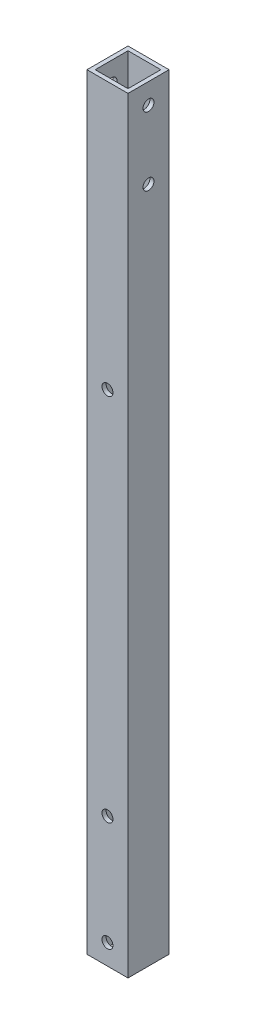
ISO-10303-21;
HEADER;
FILE_DESCRIPTION(('STEP AP214'),'2;1');
FILE_NAME('part.step','',(''),(''),'','','');
FILE_SCHEMA(('AUTOMOTIVE_DESIGN { 1 0 10303 214 1 1 1 1 }'));
ENDSEC;
DATA;
#1=APPLICATION_CONTEXT('core data for automotive mechanical design processes');
#2=APPLICATION_PROTOCOL_DEFINITION('international standard','automotive_design',2000,#1);
#3=PRODUCT_CONTEXT('',#1,'mechanical');
#4=PRODUCT('Part','Part','',(#3));
#5=PRODUCT_RELATED_PRODUCT_CATEGORY('part','',(#4));
#6=PRODUCT_DEFINITION_FORMATION('','',#4);
#7=PRODUCT_DEFINITION_CONTEXT('part definition',#1,'design');
#8=PRODUCT_DEFINITION('design','',#6,#7);
#9=PRODUCT_DEFINITION_SHAPE('','',#8);
#10=(LENGTH_UNIT() NAMED_UNIT(*) SI_UNIT(.MILLI.,.METRE.));
#11=(NAMED_UNIT(*) PLANE_ANGLE_UNIT() SI_UNIT($,.RADIAN.));
#12=(NAMED_UNIT(*) SI_UNIT($,.STERADIAN.) SOLID_ANGLE_UNIT());
#13=UNCERTAINTY_MEASURE_WITH_UNIT(LENGTH_MEASURE(1.E-05),#10,'distance_accuracy_value','');
#14=(GEOMETRIC_REPRESENTATION_CONTEXT(3) GLOBAL_UNCERTAINTY_ASSIGNED_CONTEXT((#13)) GLOBAL_UNIT_ASSIGNED_CONTEXT((#10,
#11,#12)) REPRESENTATION_CONTEXT('',''));
#15=CARTESIAN_POINT('',(0.,0.,0.));
#16=DIRECTION('',(0.,0.,1.));
#17=DIRECTION('',(1.,0.,0.));
#18=AXIS2_PLACEMENT_3D('',#15,#16,#17);
#19=CARTESIAN_POINT('',(0.,280.,0.));
#20=DIRECTION('',(0.,1.,0.));
#21=DIRECTION('',(0.,0.,1.));
#22=AXIS2_PLACEMENT_3D('',#19,#20,#21);
#23=PLANE('',#22);
#24=DIRECTION('',(0.,0.,-1.));
#25=VECTOR('',#24,1.);
#26=CARTESIAN_POINT('',(7.5,280.,7.5));
#27=LINE('',#26,#25);
#28=CARTESIAN_POINT('',(7.5,280.,7.5));
#29=VERTEX_POINT('',#28);
#30=CARTESIAN_POINT('',(7.5,280.,-7.5));
#31=VERTEX_POINT('',#30);
#32=EDGE_CURVE('E181',#29,#31,#27,.T.);
#33=ORIENTED_EDGE('',*,*,#32,.T.);
#34=DIRECTION('',(-1.,0.,0.));
#35=VECTOR('',#34,1.);
#36=CARTESIAN_POINT('',(-7.5,280.,-7.5));
#37=LINE('',#36,#35);
#38=CARTESIAN_POINT('',(-7.5,280.,-7.5));
#39=VERTEX_POINT('',#38);
#40=EDGE_CURVE('E185',#31,#39,#37,.T.);
#41=ORIENTED_EDGE('',*,*,#40,.T.);
#42=DIRECTION('',(0.,0.,1.));
#43=VECTOR('',#42,1.);
#44=CARTESIAN_POINT('',(-7.5,280.,7.5));
#45=LINE('',#44,#43);
#46=CARTESIAN_POINT('',(-7.5,280.,7.5));
#47=VERTEX_POINT('',#46);
#48=EDGE_CURVE('E189',#39,#47,#45,.T.);
#49=ORIENTED_EDGE('',*,*,#48,.T.);
#50=DIRECTION('',(1.,0.,0.));
#51=VECTOR('',#50,1.);
#52=CARTESIAN_POINT('',(-7.5,280.,7.5));
#53=LINE('',#52,#51);
#54=EDGE_CURVE('E192',#47,#29,#53,.T.);
#55=ORIENTED_EDGE('',*,*,#54,.T.);
#56=EDGE_LOOP('',(#33,#41,#49,#55));
#57=FACE_BOUND('',#56,.T.);
#58=DIRECTION('',(-1.,0.,0.));
#59=VECTOR('',#58,1.);
#60=CARTESIAN_POINT('',(0.,280.,-6.));
#61=LINE('',#60,#59);
#62=CARTESIAN_POINT('',(6.,280.,-6.));
#63=VERTEX_POINT('',#62);
#64=CARTESIAN_POINT('',(-6.,280.,-6.));
#65=VERTEX_POINT('',#64);
#66=EDGE_CURVE('E140',#63,#65,#61,.T.);
#67=ORIENTED_EDGE('',*,*,#66,.F.);
#68=DIRECTION('',(0.,0.,-1.));
#69=VECTOR('',#68,1.);
#70=CARTESIAN_POINT('',(6.,280.,0.));
#71=LINE('',#70,#69);
#72=CARTESIAN_POINT('',(6.,280.,6.));
#73=VERTEX_POINT('',#72);
#74=EDGE_CURVE('E131',#73,#63,#71,.T.);
#75=ORIENTED_EDGE('',*,*,#74,.F.);
#76=DIRECTION('',(1.,0.,0.));
#77=VECTOR('',#76,1.);
#78=CARTESIAN_POINT('',(0.,280.,6.));
#79=LINE('',#78,#77);
#80=CARTESIAN_POINT('',(-6.,280.,6.));
#81=VERTEX_POINT('',#80);
#82=EDGE_CURVE('E157',#81,#73,#79,.T.);
#83=ORIENTED_EDGE('',*,*,#82,.F.);
#84=DIRECTION('',(0.,0.,1.));
#85=VECTOR('',#84,1.);
#86=CARTESIAN_POINT('',(-6.,280.,0.));
#87=LINE('',#86,#85);
#88=EDGE_CURVE('E153',#65,#81,#87,.T.);
#89=ORIENTED_EDGE('',*,*,#88,.F.);
#90=EDGE_LOOP('',(#67,#75,#83,#89));
#91=FACE_BOUND('',#90,.T.);
#92=ADVANCED_FACE('F63',(#57,#91),#23,.T.);
#93=CARTESIAN_POINT('',(0.,0.,0.));
#94=DIRECTION('',(0.,1.,0.));
#95=DIRECTION('',(0.,0.,1.));
#96=AXIS2_PLACEMENT_3D('',#93,#94,#95);
#97=PLANE('',#96);
#98=DIRECTION('',(0.,0.,-1.));
#99=VECTOR('',#98,1.);
#100=CARTESIAN_POINT('',(7.5,0.,7.5));
#101=LINE('',#100,#99);
#102=CARTESIAN_POINT('',(7.5,0.,7.5));
#103=VERTEX_POINT('',#102);
#104=CARTESIAN_POINT('',(7.5,0.,-7.5));
#105=VERTEX_POINT('',#104);
#106=EDGE_CURVE('E149',#103,#105,#101,.T.);
#107=ORIENTED_EDGE('',*,*,#106,.F.);
#108=DIRECTION('',(1.,0.,0.));
#109=VECTOR('',#108,1.);
#110=CARTESIAN_POINT('',(-7.5,0.,7.5));
#111=LINE('',#110,#109);
#112=CARTESIAN_POINT('',(-7.5,0.,7.5));
#113=VERTEX_POINT('',#112);
#114=EDGE_CURVE('E186',#113,#103,#111,.T.);
#115=ORIENTED_EDGE('',*,*,#114,.F.);
#116=DIRECTION('',(0.,0.,1.));
#117=VECTOR('',#116,1.);
#118=CARTESIAN_POINT('',(-7.5,0.,7.5));
#119=LINE('',#118,#117);
#120=CARTESIAN_POINT('',(-7.5,0.,-7.5));
#121=VERTEX_POINT('',#120);
#122=EDGE_CURVE('E202',#121,#113,#119,.T.);
#123=ORIENTED_EDGE('',*,*,#122,.F.);
#124=DIRECTION('',(-1.,0.,0.));
#125=VECTOR('',#124,1.);
#126=CARTESIAN_POINT('',(-7.5,0.,-7.5));
#127=LINE('',#126,#125);
#128=EDGE_CURVE('E199',#105,#121,#127,.T.);
#129=ORIENTED_EDGE('',*,*,#128,.F.);
#130=EDGE_LOOP('',(#107,#115,#123,#129));
#131=FACE_BOUND('',#130,.T.);
#132=DIRECTION('',(0.,0.,-1.));
#133=VECTOR('',#132,1.);
#134=CARTESIAN_POINT('',(6.,0.,0.));
#135=LINE('',#134,#133);
#136=CARTESIAN_POINT('',(6.,0.,6.));
#137=VERTEX_POINT('',#136);
#138=CARTESIAN_POINT('',(6.,0.,-6.));
#139=VERTEX_POINT('',#138);
#140=EDGE_CURVE('E89',#137,#139,#135,.T.);
#141=ORIENTED_EDGE('',*,*,#140,.T.);
#142=DIRECTION('',(-1.,0.,0.));
#143=VECTOR('',#142,1.);
#144=CARTESIAN_POINT('',(0.,0.,-6.));
#145=LINE('',#144,#143);
#146=CARTESIAN_POINT('',(-6.,0.,-6.));
#147=VERTEX_POINT('',#146);
#148=EDGE_CURVE('E147',#139,#147,#145,.T.);
#149=ORIENTED_EDGE('',*,*,#148,.T.);
#150=DIRECTION('',(0.,0.,1.));
#151=VECTOR('',#150,1.);
#152=CARTESIAN_POINT('',(-6.,0.,0.));
#153=LINE('',#152,#151);
#154=CARTESIAN_POINT('',(-6.,0.,6.));
#155=VERTEX_POINT('',#154);
#156=EDGE_CURVE('E168',#147,#155,#153,.T.);
#157=ORIENTED_EDGE('',*,*,#156,.T.);
#158=DIRECTION('',(1.,0.,0.));
#159=VECTOR('',#158,1.);
#160=CARTESIAN_POINT('',(0.,0.,6.));
#161=LINE('',#160,#159);
#162=EDGE_CURVE('E141',#155,#137,#161,.T.);
#163=ORIENTED_EDGE('',*,*,#162,.T.);
#164=EDGE_LOOP('',(#141,#149,#157,#163));
#165=FACE_BOUND('',#164,.T.);
#166=ADVANCED_FACE('F295',(#131,#165),#97,.F.);
#167=CARTESIAN_POINT('',(7.5,280.,7.5));
#168=DIRECTION('',(-1.,0.,0.));
#169=DIRECTION('',(0.,0.,1.));
#170=AXIS2_PLACEMENT_3D('',#167,#168,#169);
#171=PLANE('',#170);
#172=CARTESIAN_POINT('',(7.5,272.5,0.));
#173=DIRECTION('',(1.,0.,0.));
#174=DIRECTION('',(0.,0.,-1.));
#175=AXIS2_PLACEMENT_3D('',#172,#173,#174);
#176=CIRCLE('',#175,2.);
#177=CARTESIAN_POINT('',(7.5,272.5,-2.));
#178=VERTEX_POINT('',#177);
#179=EDGE_CURVE('E258',#178,#178,#176,.T.);
#180=ORIENTED_EDGE('',*,*,#179,.F.);
#181=EDGE_LOOP('',(#180));
#182=FACE_BOUND('',#181,.T.);
#183=CARTESIAN_POINT('',(7.5,247.5,0.));
#184=DIRECTION('',(1.,0.,0.));
#185=DIRECTION('',(0.,0.,-1.));
#186=AXIS2_PLACEMENT_3D('',#183,#184,#185);
#187=CIRCLE('',#186,2.);
#188=CARTESIAN_POINT('',(7.5,247.5,-2.));
#189=VERTEX_POINT('',#188);
#190=EDGE_CURVE('E254',#189,#189,#187,.T.);
#191=ORIENTED_EDGE('',*,*,#190,.F.);
#192=EDGE_LOOP('',(#191));
#193=FACE_BOUND('',#192,.T.);
#194=ORIENTED_EDGE('',*,*,#106,.T.);
#195=DIRECTION('',(0.,-1.,0.));
#196=VECTOR('',#195,1.);
#197=CARTESIAN_POINT('',(7.5,280.,-7.5));
#198=LINE('',#197,#196);
#199=EDGE_CURVE('E12',#31,#105,#198,.T.);
#200=ORIENTED_EDGE('',*,*,#199,.F.);
#201=ORIENTED_EDGE('',*,*,#32,.F.);
#202=DIRECTION('',(0.,-1.,0.));
#203=VECTOR('',#202,1.);
#204=CARTESIAN_POINT('',(7.5,280.,7.5));
#205=LINE('',#204,#203);
#206=EDGE_CURVE('E195',#29,#103,#205,.T.);
#207=ORIENTED_EDGE('',*,*,#206,.T.);
#208=EDGE_LOOP('',(#194,#200,#201,#207));
#209=FACE_BOUND('',#208,.T.);
#210=ADVANCED_FACE('F65',(#182,#193,#209),#171,.F.);
#211=CARTESIAN_POINT('',(-7.5,280.,-7.5));
#212=DIRECTION('',(0.,0.,1.));
#213=DIRECTION('',(1.,0.,0.));
#214=AXIS2_PLACEMENT_3D('',#211,#212,#213);
#215=PLANE('',#214);
#216=CARTESIAN_POINT('',(0.,7.5,-7.5));
#217=DIRECTION('',(0.,0.,1.));
#218=DIRECTION('',(1.,0.,0.));
#219=AXIS2_PLACEMENT_3D('',#216,#217,#218);
#220=CIRCLE('',#219,2.);
#221=CARTESIAN_POINT('',(2.,7.5,-7.5));
#222=VERTEX_POINT('',#221);
#223=EDGE_CURVE('E231',#222,#222,#220,.T.);
#224=ORIENTED_EDGE('',*,*,#223,.T.);
#225=EDGE_LOOP('',(#224));
#226=FACE_BOUND('',#225,.T.);
#227=CARTESIAN_POINT('',(0.,47.5,-7.5));
#228=DIRECTION('',(0.,0.,1.));
#229=DIRECTION('',(1.,0.,0.));
#230=AXIS2_PLACEMENT_3D('',#227,#228,#229);
#231=CIRCLE('',#230,2.);
#232=CARTESIAN_POINT('',(2.,47.5,-7.5));
#233=VERTEX_POINT('',#232);
#234=EDGE_CURVE('E381',#233,#233,#231,.T.);
#235=ORIENTED_EDGE('',*,*,#234,.T.);
#236=EDGE_LOOP('',(#235));
#237=FACE_BOUND('',#236,.T.);
#238=CARTESIAN_POINT('',(0.,182.5,-7.5));
#239=DIRECTION('',(0.,0.,1.));
#240=DIRECTION('',(1.,0.,0.));
#241=AXIS2_PLACEMENT_3D('',#238,#239,#240);
#242=CIRCLE('',#241,2.);
#243=CARTESIAN_POINT('',(2.,182.5,-7.5));
#244=VERTEX_POINT('',#243);
#245=EDGE_CURVE('E390',#244,#244,#242,.T.);
#246=ORIENTED_EDGE('',*,*,#245,.T.);
#247=EDGE_LOOP('',(#246));
#248=FACE_BOUND('',#247,.T.);
#249=ORIENTED_EDGE('',*,*,#128,.T.);
#250=DIRECTION('',(0.,-1.,0.));
#251=VECTOR('',#250,1.);
#252=CARTESIAN_POINT('',(-7.5,280.,-7.5));
#253=LINE('',#252,#251);
#254=EDGE_CURVE('E73',#39,#121,#253,.T.);
#255=ORIENTED_EDGE('',*,*,#254,.F.);
#256=ORIENTED_EDGE('',*,*,#40,.F.);
#257=ORIENTED_EDGE('',*,*,#199,.T.);
#258=EDGE_LOOP('',(#249,#255,#256,#257));
#259=FACE_BOUND('',#258,.T.);
#260=ADVANCED_FACE('F294',(#226,#237,#248,#259),#215,.F.);
#261=CARTESIAN_POINT('',(-7.5,280.,7.5));
#262=DIRECTION('',(1.,0.,0.));
#263=DIRECTION('',(0.,0.,-1.));
#264=AXIS2_PLACEMENT_3D('',#261,#262,#263);
#265=PLANE('',#264);
#266=CARTESIAN_POINT('',(-7.5,272.5,0.));
#267=DIRECTION('',(1.,0.,0.));
#268=DIRECTION('',(0.,0.,-1.));
#269=AXIS2_PLACEMENT_3D('',#266,#267,#268);
#270=CIRCLE('',#269,2.);
#271=CARTESIAN_POINT('',(-7.5,272.5,-2.));
#272=VERTEX_POINT('',#271);
#273=EDGE_CURVE('E222',#272,#272,#270,.T.);
#274=ORIENTED_EDGE('',*,*,#273,.T.);
#275=EDGE_LOOP('',(#274));
#276=FACE_BOUND('',#275,.T.);
#277=CARTESIAN_POINT('',(-7.5,247.5,0.));
#278=DIRECTION('',(1.,0.,0.));
#279=DIRECTION('',(0.,0.,-1.));
#280=AXIS2_PLACEMENT_3D('',#277,#278,#279);
#281=CIRCLE('',#280,2.);
#282=CARTESIAN_POINT('',(-7.5,247.5,-2.));
#283=VERTEX_POINT('',#282);
#284=EDGE_CURVE('E262',#283,#283,#281,.T.);
#285=ORIENTED_EDGE('',*,*,#284,.T.);
#286=EDGE_LOOP('',(#285));
#287=FACE_BOUND('',#286,.T.);
#288=ORIENTED_EDGE('',*,*,#122,.T.);
#289=DIRECTION('',(0.,-1.,0.));
#290=VECTOR('',#289,1.);
#291=CARTESIAN_POINT('',(-7.5,280.,7.5));
#292=LINE('',#291,#290);
#293=EDGE_CURVE('E210',#47,#113,#292,.T.);
#294=ORIENTED_EDGE('',*,*,#293,.F.);
#295=ORIENTED_EDGE('',*,*,#48,.F.);
#296=ORIENTED_EDGE('',*,*,#254,.T.);
#297=EDGE_LOOP('',(#288,#294,#295,#296));
#298=FACE_BOUND('',#297,.T.);
#299=ADVANCED_FACE('F313',(#276,#287,#298),#265,.F.);
#300=CARTESIAN_POINT('',(-7.5,280.,7.5));
#301=DIRECTION('',(0.,0.,-1.));
#302=DIRECTION('',(-1.,0.,0.));
#303=AXIS2_PLACEMENT_3D('',#300,#301,#302);
#304=PLANE('',#303);
#305=CARTESIAN_POINT('',(0.,7.5,7.5));
#306=DIRECTION('',(0.,0.,1.));
#307=DIRECTION('',(1.,0.,0.));
#308=AXIS2_PLACEMENT_3D('',#305,#306,#307);
#309=CIRCLE('',#308,2.);
#310=CARTESIAN_POINT('',(2.,7.5,7.5));
#311=VERTEX_POINT('',#310);
#312=EDGE_CURVE('E377',#311,#311,#309,.T.);
#313=ORIENTED_EDGE('',*,*,#312,.F.);
#314=EDGE_LOOP('',(#313));
#315=FACE_BOUND('',#314,.T.);
#316=CARTESIAN_POINT('',(0.,47.5,7.5));
#317=DIRECTION('',(0.,0.,1.));
#318=DIRECTION('',(1.,0.,0.));
#319=AXIS2_PLACEMENT_3D('',#316,#317,#318);
#320=CIRCLE('',#319,2.);
#321=CARTESIAN_POINT('',(2.,47.5,7.5));
#322=VERTEX_POINT('',#321);
#323=EDGE_CURVE('E387',#322,#322,#320,.T.);
#324=ORIENTED_EDGE('',*,*,#323,.F.);
#325=EDGE_LOOP('',(#324));
#326=FACE_BOUND('',#325,.T.);
#327=CARTESIAN_POINT('',(0.,182.5,7.5));
#328=DIRECTION('',(0.,0.,1.));
#329=DIRECTION('',(1.,0.,0.));
#330=AXIS2_PLACEMENT_3D('',#327,#328,#329);
#331=CIRCLE('',#330,2.);
#332=CARTESIAN_POINT('',(2.,182.5,7.5));
#333=VERTEX_POINT('',#332);
#334=EDGE_CURVE('E247',#333,#333,#331,.T.);
#335=ORIENTED_EDGE('',*,*,#334,.F.);
#336=EDGE_LOOP('',(#335));
#337=FACE_BOUND('',#336,.T.);
#338=ORIENTED_EDGE('',*,*,#114,.T.);
#339=ORIENTED_EDGE('',*,*,#206,.F.);
#340=ORIENTED_EDGE('',*,*,#54,.F.);
#341=ORIENTED_EDGE('',*,*,#293,.T.);
#342=EDGE_LOOP('',(#338,#339,#340,#341));
#343=FACE_BOUND('',#342,.T.);
#344=ADVANCED_FACE('F280',(#315,#326,#337,#343),#304,.F.);
#345=CARTESIAN_POINT('',(6.,280.,0.));
#346=DIRECTION('',(-1.,0.,0.));
#347=DIRECTION('',(0.,0.,1.));
#348=AXIS2_PLACEMENT_3D('',#345,#346,#347);
#349=PLANE('',#348);
#350=CARTESIAN_POINT('',(6.,272.5,0.));
#351=DIRECTION('',(-1.,0.,0.));
#352=DIRECTION('',(0.,0.,1.));
#353=AXIS2_PLACEMENT_3D('',#350,#351,#352);
#354=CIRCLE('',#353,2.);
#355=CARTESIAN_POINT('',(6.,272.5,2.));
#356=VERTEX_POINT('',#355);
#357=EDGE_CURVE('E165',#356,#356,#354,.T.);
#358=ORIENTED_EDGE('',*,*,#357,.F.);
#359=EDGE_LOOP('',(#358));
#360=FACE_BOUND('',#359,.T.);
#361=CARTESIAN_POINT('',(6.,247.5,0.));
#362=DIRECTION('',(-1.,0.,0.));
#363=DIRECTION('',(0.,0.,1.));
#364=AXIS2_PLACEMENT_3D('',#361,#362,#363);
#365=CIRCLE('',#364,2.);
#366=CARTESIAN_POINT('',(6.,247.5,2.));
#367=VERTEX_POINT('',#366);
#368=EDGE_CURVE('E221',#367,#367,#365,.T.);
#369=ORIENTED_EDGE('',*,*,#368,.F.);
#370=EDGE_LOOP('',(#369));
#371=FACE_BOUND('',#370,.T.);
#372=ORIENTED_EDGE('',*,*,#140,.F.);
#373=DIRECTION('',(0.,-1.,0.));
#374=VECTOR('',#373,1.);
#375=CARTESIAN_POINT('',(6.,280.,6.));
#376=LINE('',#375,#374);
#377=EDGE_CURVE('E135',#73,#137,#376,.T.);
#378=ORIENTED_EDGE('',*,*,#377,.F.);
#379=ORIENTED_EDGE('',*,*,#74,.T.);
#380=DIRECTION('',(0.,-1.,0.));
#381=VECTOR('',#380,1.);
#382=CARTESIAN_POINT('',(6.,280.,-6.));
#383=LINE('',#382,#381);
#384=EDGE_CURVE('E134',#63,#139,#383,.T.);
#385=ORIENTED_EDGE('',*,*,#384,.T.);
#386=EDGE_LOOP('',(#372,#378,#379,#385));
#387=FACE_BOUND('',#386,.T.);
#388=ADVANCED_FACE('F133',(#360,#371,#387),#349,.T.);
#389=CARTESIAN_POINT('',(0.,280.,-6.));
#390=DIRECTION('',(0.,0.,1.));
#391=DIRECTION('',(1.,0.,0.));
#392=AXIS2_PLACEMENT_3D('',#389,#390,#391);
#393=PLANE('',#392);
#394=CARTESIAN_POINT('',(0.,7.5,-6.));
#395=DIRECTION('',(0.,0.,1.));
#396=DIRECTION('',(1.,0.,0.));
#397=AXIS2_PLACEMENT_3D('',#394,#395,#396);
#398=CIRCLE('',#397,2.);
#399=CARTESIAN_POINT('',(2.,7.5,-6.));
#400=VERTEX_POINT('',#399);
#401=EDGE_CURVE('E250',#400,#400,#398,.T.);
#402=ORIENTED_EDGE('',*,*,#401,.F.);
#403=EDGE_LOOP('',(#402));
#404=FACE_BOUND('',#403,.T.);
#405=CARTESIAN_POINT('',(0.,47.5,-6.));
#406=DIRECTION('',(0.,0.,1.));
#407=DIRECTION('',(1.,0.,0.));
#408=AXIS2_PLACEMENT_3D('',#405,#406,#407);
#409=CIRCLE('',#408,2.);
#410=CARTESIAN_POINT('',(2.,47.5,-6.));
#411=VERTEX_POINT('',#410);
#412=EDGE_CURVE('E235',#411,#411,#409,.T.);
#413=ORIENTED_EDGE('',*,*,#412,.F.);
#414=EDGE_LOOP('',(#413));
#415=FACE_BOUND('',#414,.T.);
#416=CARTESIAN_POINT('',(0.,182.5,-6.));
#417=DIRECTION('',(0.,0.,1.));
#418=DIRECTION('',(1.,0.,0.));
#419=AXIS2_PLACEMENT_3D('',#416,#417,#418);
#420=CIRCLE('',#419,2.);
#421=CARTESIAN_POINT('',(2.,182.5,-6.));
#422=VERTEX_POINT('',#421);
#423=EDGE_CURVE('E230',#422,#422,#420,.T.);
#424=ORIENTED_EDGE('',*,*,#423,.F.);
#425=EDGE_LOOP('',(#424));
#426=FACE_BOUND('',#425,.T.);
#427=ORIENTED_EDGE('',*,*,#148,.F.);
#428=ORIENTED_EDGE('',*,*,#384,.F.);
#429=ORIENTED_EDGE('',*,*,#66,.T.);
#430=DIRECTION('',(0.,-1.,0.));
#431=VECTOR('',#430,1.);
#432=CARTESIAN_POINT('',(-6.,280.,-6.));
#433=LINE('',#432,#431);
#434=EDGE_CURVE('E150',#65,#147,#433,.T.);
#435=ORIENTED_EDGE('',*,*,#434,.T.);
#436=EDGE_LOOP('',(#427,#428,#429,#435));
#437=FACE_BOUND('',#436,.T.);
#438=ADVANCED_FACE('F144',(#404,#415,#426,#437),#393,.T.);
#439=CARTESIAN_POINT('',(-6.,280.,0.));
#440=DIRECTION('',(1.,0.,0.));
#441=DIRECTION('',(0.,0.,-1.));
#442=AXIS2_PLACEMENT_3D('',#439,#440,#441);
#443=PLANE('',#442);
#444=CARTESIAN_POINT('',(-6.,272.5,0.));
#445=DIRECTION('',(1.,0.,0.));
#446=DIRECTION('',(0.,0.,-1.));
#447=AXIS2_PLACEMENT_3D('',#444,#445,#446);
#448=CIRCLE('',#447,2.);
#449=CARTESIAN_POINT('',(-6.,272.5,-2.));
#450=VERTEX_POINT('',#449);
#451=EDGE_CURVE('E223',#450,#450,#448,.T.);
#452=ORIENTED_EDGE('',*,*,#451,.F.);
#453=EDGE_LOOP('',(#452));
#454=FACE_BOUND('',#453,.T.);
#455=CARTESIAN_POINT('',(-6.,247.5,0.));
#456=DIRECTION('',(1.,0.,0.));
#457=DIRECTION('',(0.,0.,-1.));
#458=AXIS2_PLACEMENT_3D('',#455,#456,#457);
#459=CIRCLE('',#458,2.);
#460=CARTESIAN_POINT('',(-6.,247.5,-2.));
#461=VERTEX_POINT('',#460);
#462=EDGE_CURVE('E217',#461,#461,#459,.T.);
#463=ORIENTED_EDGE('',*,*,#462,.F.);
#464=EDGE_LOOP('',(#463));
#465=FACE_BOUND('',#464,.T.);
#466=ORIENTED_EDGE('',*,*,#156,.F.);
#467=ORIENTED_EDGE('',*,*,#434,.F.);
#468=ORIENTED_EDGE('',*,*,#88,.T.);
#469=DIRECTION('',(0.,-1.,0.));
#470=VECTOR('',#469,1.);
#471=CARTESIAN_POINT('',(-6.,280.,6.));
#472=LINE('',#471,#470);
#473=EDGE_CURVE('E81',#81,#155,#472,.T.);
#474=ORIENTED_EDGE('',*,*,#473,.T.);
#475=EDGE_LOOP('',(#466,#467,#468,#474));
#476=FACE_BOUND('',#475,.T.);
#477=ADVANCED_FACE('F334',(#454,#465,#476),#443,.T.);
#478=CARTESIAN_POINT('',(0.,280.,6.));
#479=DIRECTION('',(0.,0.,-1.));
#480=DIRECTION('',(-1.,0.,0.));
#481=AXIS2_PLACEMENT_3D('',#478,#479,#480);
#482=PLANE('',#481);
#483=CARTESIAN_POINT('',(0.,7.5,6.));
#484=DIRECTION('',(0.,0.,-1.));
#485=DIRECTION('',(-1.,0.,0.));
#486=AXIS2_PLACEMENT_3D('',#483,#484,#485);
#487=CIRCLE('',#486,2.);
#488=CARTESIAN_POINT('',(-2.,7.5,6.));
#489=VERTEX_POINT('',#488);
#490=EDGE_CURVE('E67',#489,#489,#487,.T.);
#491=ORIENTED_EDGE('',*,*,#490,.F.);
#492=EDGE_LOOP('',(#491));
#493=FACE_BOUND('',#492,.T.);
#494=CARTESIAN_POINT('',(0.,47.5,6.));
#495=DIRECTION('',(0.,0.,-1.));
#496=DIRECTION('',(-1.,0.,0.));
#497=AXIS2_PLACEMENT_3D('',#494,#495,#496);
#498=CIRCLE('',#497,2.);
#499=CARTESIAN_POINT('',(-2.,47.5,6.));
#500=VERTEX_POINT('',#499);
#501=EDGE_CURVE('E232',#500,#500,#498,.T.);
#502=ORIENTED_EDGE('',*,*,#501,.F.);
#503=EDGE_LOOP('',(#502));
#504=FACE_BOUND('',#503,.T.);
#505=CARTESIAN_POINT('',(0.,182.5,6.));
#506=DIRECTION('',(0.,0.,-1.));
#507=DIRECTION('',(-1.,0.,0.));
#508=AXIS2_PLACEMENT_3D('',#505,#506,#507);
#509=CIRCLE('',#508,2.);
#510=CARTESIAN_POINT('',(-2.,182.5,6.));
#511=VERTEX_POINT('',#510);
#512=EDGE_CURVE('E227',#511,#511,#509,.T.);
#513=ORIENTED_EDGE('',*,*,#512,.F.);
#514=EDGE_LOOP('',(#513));
#515=FACE_BOUND('',#514,.T.);
#516=ORIENTED_EDGE('',*,*,#162,.F.);
#517=ORIENTED_EDGE('',*,*,#473,.F.);
#518=ORIENTED_EDGE('',*,*,#82,.T.);
#519=ORIENTED_EDGE('',*,*,#377,.T.);
#520=EDGE_LOOP('',(#516,#517,#518,#519));
#521=FACE_BOUND('',#520,.T.);
#522=ADVANCED_FACE('F338',(#493,#504,#515,#521),#482,.T.);
#523=CARTESIAN_POINT('',(-7.5,247.5,0.));
#524=DIRECTION('',(1.,0.,0.));
#525=DIRECTION('',(0.,0.,-1.));
#526=AXIS2_PLACEMENT_3D('',#523,#524,#525);
#527=CYLINDRICAL_SURFACE('',#526,2.);
#528=ORIENTED_EDGE('',*,*,#462,.T.);
#529=EDGE_LOOP('',(#528));
#530=FACE_BOUND('',#529,.T.);
#531=ORIENTED_EDGE('',*,*,#284,.F.);
#532=EDGE_LOOP('',(#531));
#533=FACE_BOUND('',#532,.T.);
#534=ADVANCED_FACE('F289',(#530,#533),#527,.F.);
#535=CARTESIAN_POINT('',(-7.5,272.5,0.));
#536=DIRECTION('',(1.,0.,0.));
#537=DIRECTION('',(0.,0.,-1.));
#538=AXIS2_PLACEMENT_3D('',#535,#536,#537);
#539=CYLINDRICAL_SURFACE('',#538,2.);
#540=ORIENTED_EDGE('',*,*,#451,.T.);
#541=EDGE_LOOP('',(#540));
#542=FACE_BOUND('',#541,.T.);
#543=ORIENTED_EDGE('',*,*,#273,.F.);
#544=EDGE_LOOP('',(#543));
#545=FACE_BOUND('',#544,.T.);
#546=ADVANCED_FACE('F287',(#542,#545),#539,.F.);
#547=ORIENTED_EDGE('',*,*,#368,.T.);
#548=EDGE_LOOP('',(#547));
#549=FACE_BOUND('',#548,.T.);
#550=ORIENTED_EDGE('',*,*,#190,.T.);
#551=EDGE_LOOP('',(#550));
#552=FACE_BOUND('',#551,.T.);
#553=ADVANCED_FACE('F284',(#549,#552),#527,.F.);
#554=ORIENTED_EDGE('',*,*,#357,.T.);
#555=EDGE_LOOP('',(#554));
#556=FACE_BOUND('',#555,.T.);
#557=ORIENTED_EDGE('',*,*,#179,.T.);
#558=EDGE_LOOP('',(#557));
#559=FACE_BOUND('',#558,.T.);
#560=ADVANCED_FACE('F275',(#556,#559),#539,.F.);
#561=CARTESIAN_POINT('',(0.,182.5,-7.5));
#562=DIRECTION('',(0.,0.,1.));
#563=DIRECTION('',(1.,0.,0.));
#564=AXIS2_PLACEMENT_3D('',#561,#562,#563);
#565=CYLINDRICAL_SURFACE('',#564,2.);
#566=ORIENTED_EDGE('',*,*,#512,.T.);
#567=EDGE_LOOP('',(#566));
#568=FACE_BOUND('',#567,.T.);
#569=ORIENTED_EDGE('',*,*,#334,.T.);
#570=EDGE_LOOP('',(#569));
#571=FACE_BOUND('',#570,.T.);
#572=ADVANCED_FACE('F348',(#568,#571),#565,.F.);
#573=CARTESIAN_POINT('',(0.,47.5,-7.5));
#574=DIRECTION('',(0.,0.,1.));
#575=DIRECTION('',(1.,0.,0.));
#576=AXIS2_PLACEMENT_3D('',#573,#574,#575);
#577=CYLINDRICAL_SURFACE('',#576,2.);
#578=ORIENTED_EDGE('',*,*,#501,.T.);
#579=EDGE_LOOP('',(#578));
#580=FACE_BOUND('',#579,.T.);
#581=ORIENTED_EDGE('',*,*,#323,.T.);
#582=EDGE_LOOP('',(#581));
#583=FACE_BOUND('',#582,.T.);
#584=ADVANCED_FACE('F351',(#580,#583),#577,.F.);
#585=CARTESIAN_POINT('',(0.,7.5,-7.5));
#586=DIRECTION('',(0.,0.,1.));
#587=DIRECTION('',(1.,0.,0.));
#588=AXIS2_PLACEMENT_3D('',#585,#586,#587);
#589=CYLINDRICAL_SURFACE('',#588,2.);
#590=ORIENTED_EDGE('',*,*,#490,.T.);
#591=EDGE_LOOP('',(#590));
#592=FACE_BOUND('',#591,.T.);
#593=ORIENTED_EDGE('',*,*,#312,.T.);
#594=EDGE_LOOP('',(#593));
#595=FACE_BOUND('',#594,.T.);
#596=ADVANCED_FACE('F356',(#592,#595),#589,.F.);
#597=ORIENTED_EDGE('',*,*,#423,.T.);
#598=EDGE_LOOP('',(#597));
#599=FACE_BOUND('',#598,.T.);
#600=ORIENTED_EDGE('',*,*,#245,.F.);
#601=EDGE_LOOP('',(#600));
#602=FACE_BOUND('',#601,.T.);
#603=ADVANCED_FACE('F353',(#599,#602),#565,.F.);
#604=ORIENTED_EDGE('',*,*,#412,.T.);
#605=EDGE_LOOP('',(#604));
#606=FACE_BOUND('',#605,.T.);
#607=ORIENTED_EDGE('',*,*,#234,.F.);
#608=EDGE_LOOP('',(#607));
#609=FACE_BOUND('',#608,.T.);
#610=ADVANCED_FACE('F357',(#606,#609),#577,.F.);
#611=ORIENTED_EDGE('',*,*,#401,.T.);
#612=EDGE_LOOP('',(#611));
#613=FACE_BOUND('',#612,.T.);
#614=ORIENTED_EDGE('',*,*,#223,.F.);
#615=EDGE_LOOP('',(#614));
#616=FACE_BOUND('',#615,.T.);
#617=ADVANCED_FACE('F360',(#613,#616),#589,.F.);
#618=CLOSED_SHELL('',(#92,#166,#210,#260,#299,#344,#388,#438,#477,#522,#534,#546,#553,#560,#572,
#584,#596,#603,#610,#617));
#619=MANIFOLD_SOLID_BREP('B2',#618);
#620=ADVANCED_BREP_SHAPE_REPRESENTATION('',(#18,#619),#14);
#621=SHAPE_DEFINITION_REPRESENTATION(#9,#620);
ENDSEC;
END-ISO-10303-21;
